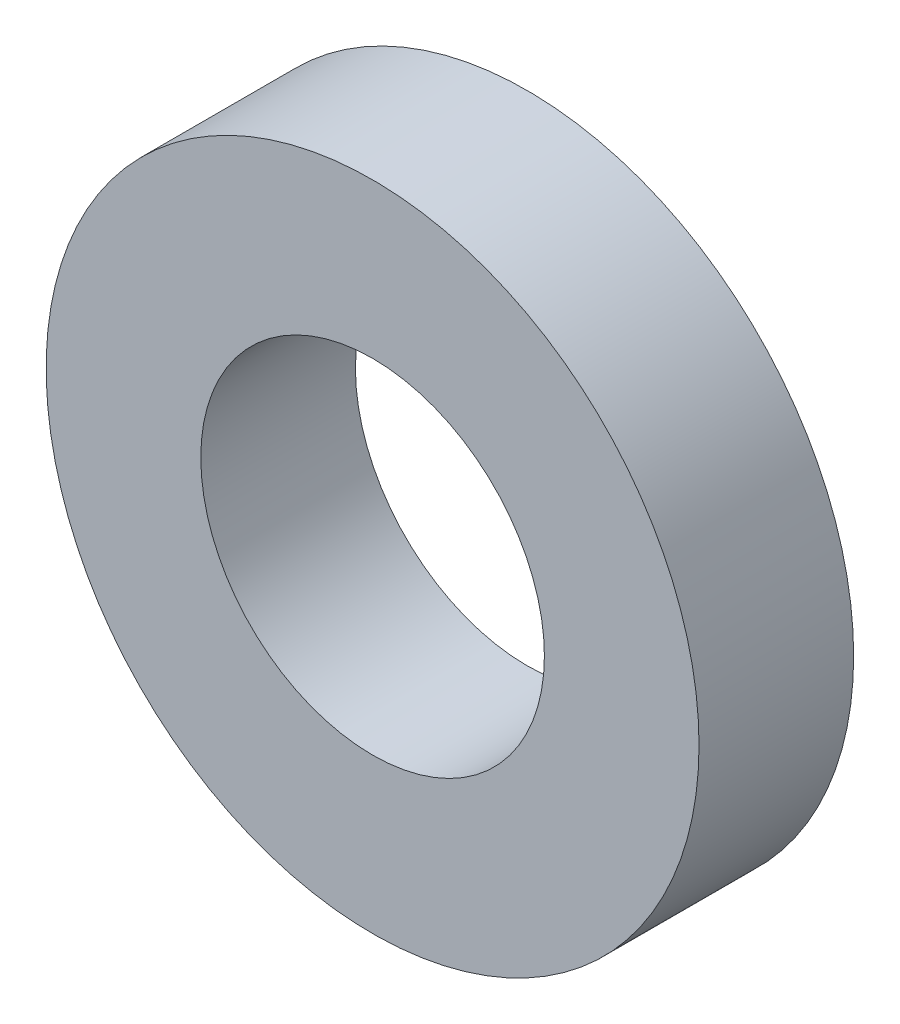
ISO-10303-21;
HEADER;
FILE_DESCRIPTION(('STEP AP214'),'2;1');
FILE_NAME('part.step','',(''),(''),'','','');
FILE_SCHEMA(('AUTOMOTIVE_DESIGN { 1 0 10303 214 1 1 1 1 }'));
ENDSEC;
DATA;
#1=APPLICATION_CONTEXT('core data for automotive mechanical design processes');
#2=APPLICATION_PROTOCOL_DEFINITION('international standard','automotive_design',2000,#1);
#3=PRODUCT_CONTEXT('',#1,'mechanical');
#4=PRODUCT('Part','Part','',(#3));
#5=PRODUCT_RELATED_PRODUCT_CATEGORY('part','',(#4));
#6=PRODUCT_DEFINITION_FORMATION('','',#4);
#7=PRODUCT_DEFINITION_CONTEXT('part definition',#1,'design');
#8=PRODUCT_DEFINITION('design','',#6,#7);
#9=PRODUCT_DEFINITION_SHAPE('','',#8);
#10=(LENGTH_UNIT() NAMED_UNIT(*) SI_UNIT(.MILLI.,.METRE.));
#11=(NAMED_UNIT(*) PLANE_ANGLE_UNIT() SI_UNIT($,.RADIAN.));
#12=(NAMED_UNIT(*) SI_UNIT($,.STERADIAN.) SOLID_ANGLE_UNIT());
#13=UNCERTAINTY_MEASURE_WITH_UNIT(LENGTH_MEASURE(1.E-05),#10,'distance_accuracy_value','');
#14=(GEOMETRIC_REPRESENTATION_CONTEXT(3) GLOBAL_UNCERTAINTY_ASSIGNED_CONTEXT((#13)) GLOBAL_UNIT_ASSIGNED_CONTEXT((#10,
#11,#12)) REPRESENTATION_CONTEXT('',''));
#15=CARTESIAN_POINT('',(0.,0.,0.));
#16=DIRECTION('',(0.,0.,1.));
#17=DIRECTION('',(1.,0.,0.));
#18=AXIS2_PLACEMENT_3D('',#15,#16,#17);
#19=CARTESIAN_POINT('',(0.,0.,2.25));
#20=DIRECTION('',(0.,0.,1.));
#21=DIRECTION('',(1.,0.,0.));
#22=AXIS2_PLACEMENT_3D('',#19,#20,#21);
#23=PLANE('',#22);
#24=CARTESIAN_POINT('',(0.,0.,2.25));
#25=DIRECTION('',(0.,0.,1.));
#26=DIRECTION('',(1.,0.,0.));
#27=AXIS2_PLACEMENT_3D('',#24,#25,#26);
#28=CIRCLE('',#27,9.5);
#29=CARTESIAN_POINT('',(9.5,0.,2.25));
#30=VERTEX_POINT('',#29);
#31=EDGE_CURVE('E10',#30,#30,#28,.T.);
#32=ORIENTED_EDGE('',*,*,#31,.T.);
#33=EDGE_LOOP('',(#32));
#34=FACE_BOUND('',#33,.T.);
#35=CARTESIAN_POINT('',(0.,0.,2.25));
#36=DIRECTION('',(0.,0.,1.));
#37=DIRECTION('',(1.,0.,0.));
#38=AXIS2_PLACEMENT_3D('',#35,#36,#37);
#39=CIRCLE('',#38,5.);
#40=CARTESIAN_POINT('',(5.,0.,2.25));
#41=VERTEX_POINT('',#40);
#42=EDGE_CURVE('E42',#41,#41,#39,.T.);
#43=ORIENTED_EDGE('',*,*,#42,.F.);
#44=EDGE_LOOP('',(#43));
#45=FACE_BOUND('',#44,.T.);
#46=ADVANCED_FACE('F31',(#34,#45),#23,.T.);
#47=CARTESIAN_POINT('',(0.,0.,-2.25));
#48=DIRECTION('',(0.,0.,1.));
#49=DIRECTION('',(1.,0.,0.));
#50=AXIS2_PLACEMENT_3D('',#47,#48,#49);
#51=PLANE('',#50);
#52=CARTESIAN_POINT('',(0.,0.,-2.25));
#53=DIRECTION('',(0.,0.,1.));
#54=DIRECTION('',(1.,0.,0.));
#55=AXIS2_PLACEMENT_3D('',#52,#53,#54);
#56=CIRCLE('',#55,9.5);
#57=CARTESIAN_POINT('',(9.5,0.,-2.25));
#58=VERTEX_POINT('',#57);
#59=EDGE_CURVE('E35',#58,#58,#56,.T.);
#60=ORIENTED_EDGE('',*,*,#59,.F.);
#61=EDGE_LOOP('',(#60));
#62=FACE_BOUND('',#61,.T.);
#63=CARTESIAN_POINT('',(0.,0.,-2.25));
#64=DIRECTION('',(0.,0.,1.));
#65=DIRECTION('',(1.,0.,0.));
#66=AXIS2_PLACEMENT_3D('',#63,#64,#65);
#67=CIRCLE('',#66,5.);
#68=CARTESIAN_POINT('',(5.,0.,-2.25));
#69=VERTEX_POINT('',#68);
#70=EDGE_CURVE('E44',#69,#69,#67,.T.);
#71=ORIENTED_EDGE('',*,*,#70,.T.);
#72=EDGE_LOOP('',(#71));
#73=FACE_BOUND('',#72,.T.);
#74=ADVANCED_FACE('F54',(#62,#73),#51,.F.);
#75=CARTESIAN_POINT('',(0.,0.,2.25));
#76=DIRECTION('',(0.,0.,-1.));
#77=DIRECTION('',(-1.,0.,0.));
#78=AXIS2_PLACEMENT_3D('',#75,#76,#77);
#79=CYLINDRICAL_SURFACE('',#78,9.5);
#80=ORIENTED_EDGE('',*,*,#31,.F.);
#81=EDGE_LOOP('',(#80));
#82=FACE_BOUND('',#81,.T.);
#83=ORIENTED_EDGE('',*,*,#59,.T.);
#84=EDGE_LOOP('',(#83));
#85=FACE_BOUND('',#84,.T.);
#86=ADVANCED_FACE('F33',(#82,#85),#79,.T.);
#87=CARTESIAN_POINT('',(0.,0.,2.25));
#88=DIRECTION('',(0.,0.,-1.));
#89=DIRECTION('',(-1.,0.,0.));
#90=AXIS2_PLACEMENT_3D('',#87,#88,#89);
#91=CYLINDRICAL_SURFACE('',#90,5.);
#92=ORIENTED_EDGE('',*,*,#42,.T.);
#93=EDGE_LOOP('',(#92));
#94=FACE_BOUND('',#93,.T.);
#95=ORIENTED_EDGE('',*,*,#70,.F.);
#96=EDGE_LOOP('',(#95));
#97=FACE_BOUND('',#96,.T.);
#98=ADVANCED_FACE('F50',(#94,#97),#91,.F.);
#99=CLOSED_SHELL('',(#46,#74,#86,#98));
#100=MANIFOLD_SOLID_BREP('B2',#99);
#101=ADVANCED_BREP_SHAPE_REPRESENTATION('',(#18,#100),#14);
#102=SHAPE_DEFINITION_REPRESENTATION(#9,#101);
ENDSEC;
END-ISO-10303-21;
